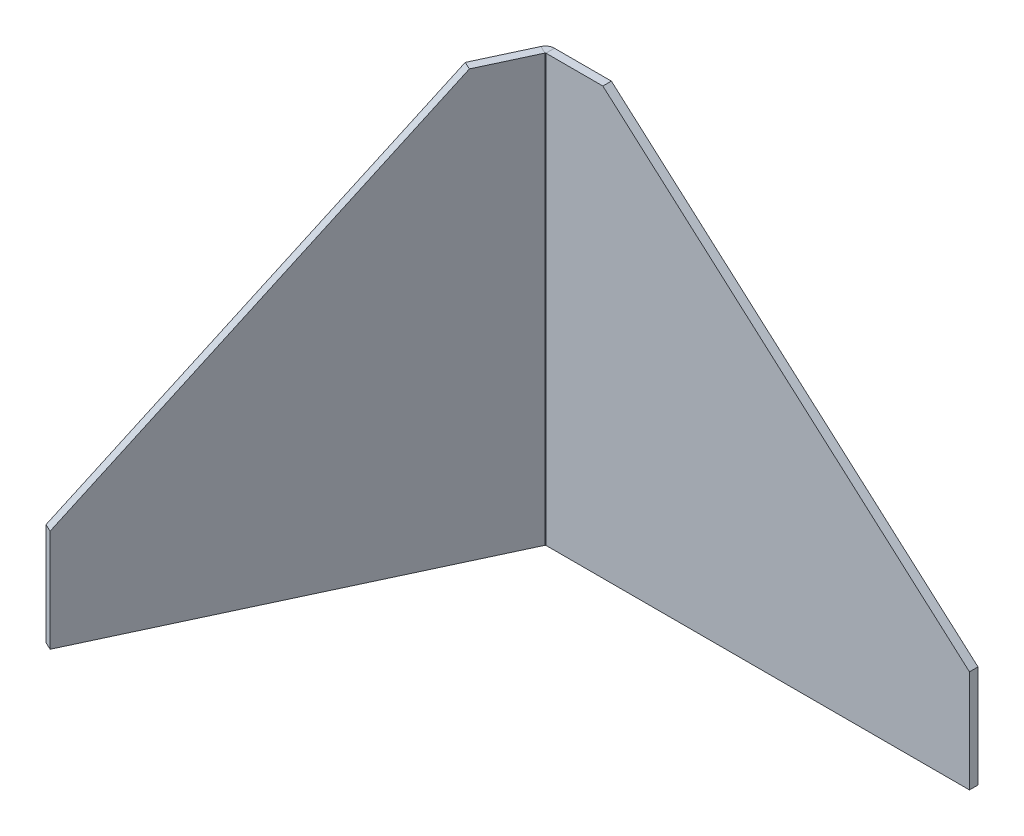
ISO-10303-21;
HEADER;
FILE_DESCRIPTION(('STEP AP214'),'2;1');
FILE_NAME('part.step','',(''),(''),'','','');
FILE_SCHEMA(('AUTOMOTIVE_DESIGN { 1 0 10303 214 1 1 1 1 }'));
ENDSEC;
DATA;
#1=APPLICATION_CONTEXT('core data for automotive mechanical design processes');
#2=APPLICATION_PROTOCOL_DEFINITION('international standard','automotive_design',2000,#1);
#3=PRODUCT_CONTEXT('',#1,'mechanical');
#4=PRODUCT('Part','Part','',(#3));
#5=PRODUCT_RELATED_PRODUCT_CATEGORY('part','',(#4));
#6=PRODUCT_DEFINITION_FORMATION('','',#4);
#7=PRODUCT_DEFINITION_CONTEXT('part definition',#1,'design');
#8=PRODUCT_DEFINITION('design','',#6,#7);
#9=PRODUCT_DEFINITION_SHAPE('','',#8);
#10=(LENGTH_UNIT() NAMED_UNIT(*) SI_UNIT(.MILLI.,.METRE.));
#11=(NAMED_UNIT(*) PLANE_ANGLE_UNIT() SI_UNIT($,.RADIAN.));
#12=(NAMED_UNIT(*) SI_UNIT($,.STERADIAN.) SOLID_ANGLE_UNIT());
#13=UNCERTAINTY_MEASURE_WITH_UNIT(LENGTH_MEASURE(1.E-05),#10,'distance_accuracy_value','');
#14=(GEOMETRIC_REPRESENTATION_CONTEXT(3) GLOBAL_UNCERTAINTY_ASSIGNED_CONTEXT((#13)) GLOBAL_UNIT_ASSIGNED_CONTEXT((#10,
#11,#12)) REPRESENTATION_CONTEXT('',''));
#15=CARTESIAN_POINT('',(0.,0.,0.));
#16=DIRECTION('',(0.,0.,1.));
#17=DIRECTION('',(1.,0.,0.));
#18=AXIS2_PLACEMENT_3D('',#15,#16,#17);
#19=CARTESIAN_POINT('',(-143490.189595738,128567.414220515,-6.74999347933181));
#20=DIRECTION('',(0.,1.,0.));
#21=DIRECTION('',(0.906307787036651,0.,0.422618261740697));
#22=AXIS2_PLACEMENT_3D('',#19,#20,#21);
#23=PLANE('',#22);
#24=DIRECTION('',(-0.422618261740697,0.,0.906307787036651));
#25=VECTOR('',#24,1.);
#26=CARTESIAN_POINT('',(-143481.126517868,128567.414220515,-2.52381086192988));
#27=LINE('',#26,#25);
#28=CARTESIAN_POINT('',(-143482.501710563,128567.414220515,0.425299388402189));
#29=VERTEX_POINT('',#28);
#30=CARTESIAN_POINT('',(-143510.70979619,128567.414220515,60.9177342306285));
#31=VERTEX_POINT('',#30);
#32=EDGE_CURVE('E149',#29,#31,#27,.T.);
#33=ORIENTED_EDGE('',*,*,#32,.F.);
#34=DIRECTION('',(-0.906307787036651,0.,-0.422618261740697));
#35=VECTOR('',#34,1.);
#36=CARTESIAN_POINT('',(-143491.564788433,128567.414220515,-3.80088322901884));
#37=LINE('',#36,#35);
#38=CARTESIAN_POINT('',(-143491.564788433,128567.414220515,-3.80088322899619));
#39=VERTEX_POINT('',#38);
#40=EDGE_CURVE('E133',#29,#39,#37,.T.);
#41=ORIENTED_EDGE('',*,*,#40,.T.);
#42=DIRECTION('',(-0.422618261740697,0.,0.906307787036651));
#43=VECTOR('',#42,1.);
#44=CARTESIAN_POINT('',(-143490.189595738,128567.414220515,-6.74999347933181));
#45=LINE('',#44,#43);
#46=CARTESIAN_POINT('',(-143519.77287406,128567.414220515,56.6915516132269));
#47=VERTEX_POINT('',#46);
#48=EDGE_CURVE('E44',#39,#47,#45,.T.);
#49=ORIENTED_EDGE('',*,*,#48,.T.);
#50=DIRECTION('',(0.906307787036651,0.,0.422618261740697));
#51=VECTOR('',#50,1.);
#52=CARTESIAN_POINT('',(-143519.77287406,128567.414220515,56.6915516132269));
#53=LINE('',#52,#51);
#54=EDGE_CURVE('E158',#47,#31,#53,.T.);
#55=ORIENTED_EDGE('',*,*,#54,.T.);
#56=EDGE_LOOP('',(#33,#41,#49,#55));
#57=FACE_BOUND('',#56,.T.);
#58=ADVANCED_FACE('F40',(#57),#23,.T.);
#59=CARTESIAN_POINT('',(-143676.141630904,128067.414220515,392.02543281678));
#60=DIRECTION('',(0.,-1.,0.));
#61=DIRECTION('',(-0.906307787036651,0.,-0.422618261740697));
#62=AXIS2_PLACEMENT_3D('',#59,#60,#61);
#63=PLANE('',#62);
#64=DIRECTION('',(0.422618261740697,0.,-0.906307787036651));
#65=VECTOR('',#64,1.);
#66=CARTESIAN_POINT('',(-143676.141630904,128067.414220515,392.02543281678));
#67=LINE('',#66,#65);
#68=CARTESIAN_POINT('',(-143676.141630904,128067.414220515,392.02543281678));
#69=VERTEX_POINT('',#68);
#70=CARTESIAN_POINT('',(-143491.564788433,128067.414220515,-3.80088322901884));
#71=VERTEX_POINT('',#70);
#72=EDGE_CURVE('E156',#69,#71,#67,.T.);
#73=ORIENTED_EDGE('',*,*,#72,.T.);
#74=DIRECTION('',(0.906307787036651,0.,0.422618261740697));
#75=VECTOR('',#74,1.);
#76=CARTESIAN_POINT('',(-143491.564788433,128067.414220515,-3.80088322901884));
#77=LINE('',#76,#75);
#78=CARTESIAN_POINT('',(-143482.501710563,128067.414220515,0.425299388402856));
#79=VERTEX_POINT('',#78);
#80=EDGE_CURVE('E12',#71,#79,#77,.T.);
#81=ORIENTED_EDGE('',*,*,#80,.T.);
#82=DIRECTION('',(0.422618261740697,0.,-0.906307787036651));
#83=VECTOR('',#82,1.);
#84=CARTESIAN_POINT('',(-143667.078553034,128067.414220515,396.251615434182));
#85=LINE('',#84,#83);
#86=CARTESIAN_POINT('',(-143667.078553034,128067.414220515,396.251615434182));
#87=VERTEX_POINT('',#86);
#88=EDGE_CURVE('E160',#87,#79,#85,.T.);
#89=ORIENTED_EDGE('',*,*,#88,.F.);
#90=DIRECTION('',(0.906307787036651,0.,0.422618261740697));
#91=VECTOR('',#90,1.);
#92=CARTESIAN_POINT('',(-143676.141630904,128067.414220515,392.02543281678));
#93=LINE('',#92,#91);
#94=EDGE_CURVE('E66',#69,#87,#93,.T.);
#95=ORIENTED_EDGE('',*,*,#94,.F.);
#96=EDGE_LOOP('',(#73,#81,#89,#95));
#97=FACE_BOUND('',#96,.T.);
#98=ADVANCED_FACE('F42',(#97),#63,.T.);
#99=CARTESIAN_POINT('',(-82850.7710740879,8.5265128291212E-11,-130048.402668836));
#100=DIRECTION('',(-0.906307787036651,0.,-0.422618261740697));
#101=DIRECTION('',(-0.422618261740697,0.,0.906307787036651));
#102=AXIS2_PLACEMENT_3D('',#99,#100,#101);
#103=PLANE('',#102);
#104=ORIENTED_EDGE('',*,*,#48,.F.);
#105=DIRECTION('',(0.,-1.,0.));
#106=VECTOR('',#105,1.);
#107=CARTESIAN_POINT('',(-143491.564788433,0.,-3.80088322901884));
#108=LINE('',#107,#106);
#109=EDGE_CURVE('E128',#39,#71,#108,.T.);
#110=ORIENTED_EDGE('',*,*,#109,.T.);
#111=ORIENTED_EDGE('',*,*,#72,.F.);
#112=DIRECTION('',(0.,-1.,0.));
#113=VECTOR('',#112,1.);
#114=CARTESIAN_POINT('',(-143676.141630904,128067.414220515,392.02543281678));
#115=LINE('',#114,#113);
#116=CARTESIAN_POINT('',(-143676.141630904,128187.414220515,392.02543281678));
#117=VERTEX_POINT('',#116);
#118=EDGE_CURVE('E159',#117,#69,#115,.T.);
#119=ORIENTED_EDGE('',*,*,#118,.F.);
#120=DIRECTION('',(-0.294825549996127,-0.716471188104806,0.632255432309734));
#121=VECTOR('',#120,1.);
#122=CARTESIAN_POINT('',(-143676.141630904,128187.414220515,392.02543281678));
#123=LINE('',#122,#121);
#124=EDGE_CURVE('E148',#47,#117,#123,.T.);
#125=ORIENTED_EDGE('',*,*,#124,.F.);
#126=EDGE_LOOP('',(#104,#110,#111,#119,#125));
#127=FACE_BOUND('',#126,.T.);
#128=ADVANCED_FACE('F145',(#127),#103,.T.);
#129=CARTESIAN_POINT('',(-143676.141630904,128067.414220515,392.02543281678));
#130=DIRECTION('',(-0.422618261740697,0.,0.906307787036651));
#131=DIRECTION('',(0.906307787036651,0.,0.422618261740697));
#132=AXIS2_PLACEMENT_3D('',#129,#130,#131);
#133=PLANE('',#132);
#134=DIRECTION('',(0.,-1.,0.));
#135=VECTOR('',#134,1.);
#136=CARTESIAN_POINT('',(-143667.078553034,128067.414220515,396.251615434182));
#137=LINE('',#136,#135);
#138=CARTESIAN_POINT('',(-143667.078553034,128187.414220515,396.251615434181));
#139=VERTEX_POINT('',#138);
#140=EDGE_CURVE('E162',#139,#87,#137,.T.);
#141=ORIENTED_EDGE('',*,*,#140,.F.);
#142=DIRECTION('',(0.906307787036651,0.,0.422618261740697));
#143=VECTOR('',#142,1.);
#144=CARTESIAN_POINT('',(-143676.141630904,128187.414220515,392.02543281678));
#145=LINE('',#144,#143);
#146=EDGE_CURVE('E170',#117,#139,#145,.T.);
#147=ORIENTED_EDGE('',*,*,#146,.F.);
#148=ORIENTED_EDGE('',*,*,#118,.T.);
#149=ORIENTED_EDGE('',*,*,#94,.T.);
#150=EDGE_LOOP('',(#141,#147,#148,#149));
#151=FACE_BOUND('',#150,.T.);
#152=ADVANCED_FACE('F265',(#151),#133,.T.);
#153=CARTESIAN_POINT('',(-143676.141630904,128187.414220515,392.02543281678));
#154=DIRECTION('',(-0.302793808104145,0.697616683154644,0.649343416966787));
#155=DIRECTION('',(-0.294825549996127,-0.716471188104806,0.632255432309734));
#156=AXIS2_PLACEMENT_3D('',#153,#154,#155);
#157=PLANE('',#156);
#158=DIRECTION('',(-0.294825549996127,-0.716471188104806,0.632255432309734));
#159=VECTOR('',#158,1.);
#160=CARTESIAN_POINT('',(-143667.078553034,128187.414220515,396.251615434181));
#161=LINE('',#160,#159);
#162=EDGE_CURVE('E168',#31,#139,#161,.T.);
#163=ORIENTED_EDGE('',*,*,#162,.F.);
#164=ORIENTED_EDGE('',*,*,#54,.F.);
#165=ORIENTED_EDGE('',*,*,#124,.T.);
#166=ORIENTED_EDGE('',*,*,#146,.T.);
#167=EDGE_LOOP('',(#163,#164,#165,#166));
#168=FACE_BOUND('',#167,.T.);
#169=ADVANCED_FACE('F171',(#168),#157,.T.);
#170=CARTESIAN_POINT('',(-82841.7079962176,8.5265128291212E-11,-130044.176486218));
#171=DIRECTION('',(-0.906307787036651,0.,-0.422618261740697));
#172=DIRECTION('',(-0.422618261740697,0.,0.906307787036651));
#173=AXIS2_PLACEMENT_3D('',#170,#171,#172);
#174=PLANE('',#173);
#175=DIRECTION('',(0.,-1.,0.));
#176=VECTOR('',#175,1.);
#177=CARTESIAN_POINT('',(-143482.501710563,0.,0.425299388382427));
#178=LINE('',#177,#176);
#179=EDGE_CURVE('E49',#29,#79,#178,.T.);
#180=ORIENTED_EDGE('',*,*,#179,.F.);
#181=ORIENTED_EDGE('',*,*,#32,.T.);
#182=ORIENTED_EDGE('',*,*,#162,.T.);
#183=ORIENTED_EDGE('',*,*,#140,.T.);
#184=ORIENTED_EDGE('',*,*,#88,.T.);
#185=EDGE_LOOP('',(#180,#181,#182,#183,#184));
#186=FACE_BOUND('',#185,.T.);
#187=ADVANCED_FACE('F165',(#186),#174,.F.);
#188=CARTESIAN_POINT('',(-142985.088107377,128067.414220515,-10.));
#189=DIRECTION('',(1.,0.,0.));
#190=DIRECTION('',(0.,0.,-1.));
#191=AXIS2_PLACEMENT_3D('',#188,#189,#190);
#192=PLANE('',#191);
#193=DIRECTION('',(0.,1.,0.));
#194=VECTOR('',#193,1.);
#195=CARTESIAN_POINT('',(-142985.088107377,128067.414220515,0.));
#196=LINE('',#195,#194);
#197=CARTESIAN_POINT('',(-142985.088107377,128067.414220515,0.));
#198=VERTEX_POINT('',#197);
#199=CARTESIAN_POINT('',(-142985.088107377,128187.414220515,0.));
#200=VERTEX_POINT('',#199);
#201=EDGE_CURVE('E208',#198,#200,#196,.T.);
#202=ORIENTED_EDGE('',*,*,#201,.F.);
#203=DIRECTION('',(0.,0.,1.));
#204=VECTOR('',#203,1.);
#205=CARTESIAN_POINT('',(-142985.088107377,128067.414220515,-10.));
#206=LINE('',#205,#204);
#207=CARTESIAN_POINT('',(-142985.088107377,128067.414220515,-10.));
#208=VERTEX_POINT('',#207);
#209=EDGE_CURVE('E172',#208,#198,#206,.T.);
#210=ORIENTED_EDGE('',*,*,#209,.F.);
#211=DIRECTION('',(0.,1.,0.));
#212=VECTOR('',#211,1.);
#213=CARTESIAN_POINT('',(-142985.088107377,128067.414220515,-10.));
#214=LINE('',#213,#212);
#215=CARTESIAN_POINT('',(-142985.088107377,128187.414220515,-10.));
#216=VERTEX_POINT('',#215);
#217=EDGE_CURVE('E189',#208,#216,#214,.T.);
#218=ORIENTED_EDGE('',*,*,#217,.T.);
#219=DIRECTION('',(0.,0.,1.));
#220=VECTOR('',#219,1.);
#221=CARTESIAN_POINT('',(-142985.088107377,128187.414220515,-10.));
#222=LINE('',#221,#220);
#223=EDGE_CURVE('E192',#216,#200,#222,.T.);
#224=ORIENTED_EDGE('',*,*,#223,.T.);
#225=EDGE_LOOP('',(#202,#210,#218,#224));
#226=FACE_BOUND('',#225,.T.);
#227=ADVANCED_FACE('F240',(#226),#192,.T.);
#228=CARTESIAN_POINT('',(-142985.088107377,128187.414220515,-10.));
#229=DIRECTION('',(0.662197796471728,0.749329085481131,0.));
#230=DIRECTION('',(-0.749329085481131,0.662197796471728,0.));
#231=AXIS2_PLACEMENT_3D('',#228,#229,#230);
#232=PLANE('',#231);
#233=DIRECTION('',(-0.749329085481131,0.662197796471728,0.));
#234=VECTOR('',#233,1.);
#235=CARTESIAN_POINT('',(-142985.088107377,128187.414220515,0.));
#236=LINE('',#235,#234);
#237=CARTESIAN_POINT('',(-143415.088107377,128567.414220515,0.));
#238=VERTEX_POINT('',#237);
#239=EDGE_CURVE('E211',#200,#238,#236,.T.);
#240=ORIENTED_EDGE('',*,*,#239,.F.);
#241=ORIENTED_EDGE('',*,*,#223,.F.);
#242=DIRECTION('',(-0.749329085481131,0.662197796471728,0.));
#243=VECTOR('',#242,1.);
#244=CARTESIAN_POINT('',(-142985.088107377,128187.414220515,-10.));
#245=LINE('',#244,#243);
#246=CARTESIAN_POINT('',(-143415.088107377,128567.414220515,-9.99999999999979));
#247=VERTEX_POINT('',#246);
#248=EDGE_CURVE('E194',#216,#247,#245,.T.);
#249=ORIENTED_EDGE('',*,*,#248,.T.);
#250=DIRECTION('',(0.,0.,1.));
#251=VECTOR('',#250,1.);
#252=CARTESIAN_POINT('',(-143415.088107377,128567.414220515,-9.99999999999979));
#253=LINE('',#252,#251);
#254=EDGE_CURVE('E197',#247,#238,#253,.T.);
#255=ORIENTED_EDGE('',*,*,#254,.T.);
#256=EDGE_LOOP('',(#240,#241,#249,#255));
#257=FACE_BOUND('',#256,.T.);
#258=ADVANCED_FACE('F245',(#257),#232,.T.);
#259=CARTESIAN_POINT('',(0.,0.,-10.));
#260=DIRECTION('',(0.,0.,-1.));
#261=DIRECTION('',(-1.,0.,0.));
#262=AXIS2_PLACEMENT_3D('',#259,#260,#261);
#263=PLANE('',#262);
#264=DIRECTION('',(0.,-1.,0.));
#265=VECTOR('',#264,1.);
#266=CARTESIAN_POINT('',(-143481.834124247,0.,-10.));
#267=LINE('',#266,#265);
#268=CARTESIAN_POINT('',(-143481.834124247,128567.414220515,-9.99999999999601));
#269=VERTEX_POINT('',#268);
#270=CARTESIAN_POINT('',(-143481.834124247,128067.414220515,-9.99999999999934));
#271=VERTEX_POINT('',#270);
#272=EDGE_CURVE('E183',#269,#271,#267,.T.);
#273=ORIENTED_EDGE('',*,*,#272,.F.);
#274=DIRECTION('',(-1.,0.,0.));
#275=VECTOR('',#274,1.);
#276=CARTESIAN_POINT('',(-143485.088107377,128567.414220515,-10.));
#277=LINE('',#276,#275);
#278=EDGE_CURVE('E199',#247,#269,#277,.T.);
#279=ORIENTED_EDGE('',*,*,#278,.F.);
#280=ORIENTED_EDGE('',*,*,#248,.F.);
#281=ORIENTED_EDGE('',*,*,#217,.F.);
#282=DIRECTION('',(1.,0.,0.));
#283=VECTOR('',#282,1.);
#284=CARTESIAN_POINT('',(-143925.088107377,128067.414220515,-10.));
#285=LINE('',#284,#283);
#286=EDGE_CURVE('E176',#271,#208,#285,.T.);
#287=ORIENTED_EDGE('',*,*,#286,.F.);
#288=EDGE_LOOP('',(#273,#279,#280,#281,#287));
#289=FACE_BOUND('',#288,.T.);
#290=ADVANCED_FACE('F234',(#289),#263,.T.);
#291=CARTESIAN_POINT('',(-143485.088107377,128567.414220515,-10.));
#292=DIRECTION('',(0.,1.,0.));
#293=DIRECTION('',(0.,0.,1.));
#294=AXIS2_PLACEMENT_3D('',#291,#292,#293);
#295=PLANE('',#294);
#296=DIRECTION('',(0.,0.,-1.));
#297=VECTOR('',#296,1.);
#298=CARTESIAN_POINT('',(-143481.834124247,128567.414220515,-10.));
#299=LINE('',#298,#297);
#300=CARTESIAN_POINT('',(-143481.834124247,128567.414220515,0.));
#301=VERTEX_POINT('',#300);
#302=EDGE_CURVE('E141',#301,#269,#299,.T.);
#303=ORIENTED_EDGE('',*,*,#302,.F.);
#304=DIRECTION('',(-1.,0.,0.));
#305=VECTOR('',#304,1.);
#306=CARTESIAN_POINT('',(-143485.088107377,128567.414220515,0.));
#307=LINE('',#306,#305);
#308=EDGE_CURVE('E201',#238,#301,#307,.T.);
#309=ORIENTED_EDGE('',*,*,#308,.F.);
#310=ORIENTED_EDGE('',*,*,#254,.F.);
#311=ORIENTED_EDGE('',*,*,#278,.T.);
#312=EDGE_LOOP('',(#303,#309,#310,#311));
#313=FACE_BOUND('',#312,.T.);
#314=ADVANCED_FACE('F244',(#313),#295,.T.);
#315=CARTESIAN_POINT('',(0.,0.,0.));
#316=DIRECTION('',(0.,0.,-1.));
#317=DIRECTION('',(-1.,0.,0.));
#318=AXIS2_PLACEMENT_3D('',#315,#316,#317);
#319=PLANE('',#318);
#320=ORIENTED_EDGE('',*,*,#308,.T.);
#321=DIRECTION('',(0.,-1.,0.));
#322=VECTOR('',#321,1.);
#323=CARTESIAN_POINT('',(-143481.834124247,0.,0.));
#324=LINE('',#323,#322);
#325=CARTESIAN_POINT('',(-143481.834124247,128067.414220515,6.66133814775094E-13));
#326=VERTEX_POINT('',#325);
#327=EDGE_CURVE('E203',#301,#326,#324,.T.);
#328=ORIENTED_EDGE('',*,*,#327,.T.);
#329=DIRECTION('',(1.,0.,0.));
#330=VECTOR('',#329,1.);
#331=CARTESIAN_POINT('',(-143925.088107377,128067.414220515,0.));
#332=LINE('',#331,#330);
#333=EDGE_CURVE('E206',#326,#198,#332,.T.);
#334=ORIENTED_EDGE('',*,*,#333,.T.);
#335=ORIENTED_EDGE('',*,*,#201,.T.);
#336=ORIENTED_EDGE('',*,*,#239,.T.);
#337=EDGE_LOOP('',(#320,#328,#334,#335,#336));
#338=FACE_BOUND('',#337,.T.);
#339=ADVANCED_FACE('F224',(#338),#319,.F.);
#340=CARTESIAN_POINT('',(-143925.088107377,128067.414220515,-10.));
#341=DIRECTION('',(0.,-1.,0.));
#342=DIRECTION('',(0.,0.,-1.));
#343=AXIS2_PLACEMENT_3D('',#340,#341,#342);
#344=PLANE('',#343);
#345=DIRECTION('',(0.,0.,1.));
#346=VECTOR('',#345,1.);
#347=CARTESIAN_POINT('',(-143481.834124247,128067.414220515,-9.99999999999934));
#348=LINE('',#347,#346);
#349=EDGE_CURVE('E185',#271,#326,#348,.T.);
#350=ORIENTED_EDGE('',*,*,#349,.F.);
#351=ORIENTED_EDGE('',*,*,#286,.T.);
#352=ORIENTED_EDGE('',*,*,#209,.T.);
#353=ORIENTED_EDGE('',*,*,#333,.F.);
#354=EDGE_LOOP('',(#350,#351,#352,#353));
#355=FACE_BOUND('',#354,.T.);
#356=ADVANCED_FACE('F230',(#355),#344,.T.);
#357=CARTESIAN_POINT('',(-143481.834124247,128567.414220515,0.736600000000309));
#358=DIRECTION('',(0.,1.,0.));
#359=DIRECTION('',(0.,0.,1.));
#360=AXIS2_PLACEMENT_3D('',#357,#358,#359);
#361=PLANE('',#360);
#362=ORIENTED_EDGE('',*,*,#40,.F.);
#363=CARTESIAN_POINT('',(-143481.834124247,128567.414220515,0.736600000000309));
#364=DIRECTION('',(0.,1.,0.));
#365=DIRECTION('',(0.,0.,1.));
#366=AXIS2_PLACEMENT_3D('',#363,#364,#365);
#367=CIRCLE('',#366,0.7366);
#368=EDGE_CURVE('E217',#29,#301,#367,.F.);
#369=ORIENTED_EDGE('',*,*,#368,.T.);
#370=ORIENTED_EDGE('',*,*,#302,.T.);
#371=CARTESIAN_POINT('',(-143481.834124247,128567.414220515,0.736600000000309));
#372=DIRECTION('',(0.,-1.,0.));
#373=DIRECTION('',(0.,0.,1.));
#374=AXIS2_PLACEMENT_3D('',#371,#372,#373);
#375=CIRCLE('',#374,10.7365999999959);
#376=EDGE_CURVE('E131',#39,#269,#375,.T.);
#377=ORIENTED_EDGE('',*,*,#376,.F.);
#378=EDGE_LOOP('',(#362,#369,#370,#377));
#379=FACE_BOUND('',#378,.T.);
#380=ADVANCED_FACE('F137',(#379),#361,.T.);
#381=CARTESIAN_POINT('',(-143481.834124247,128067.414220515,0.736599999999976));
#382=DIRECTION('',(0.,-1.,0.));
#383=DIRECTION('',(0.,0.,-1.));
#384=AXIS2_PLACEMENT_3D('',#381,#382,#383);
#385=PLANE('',#384);
#386=CARTESIAN_POINT('',(-143481.834124247,128067.414220515,0.736599999999976));
#387=DIRECTION('',(0.,1.,0.));
#388=DIRECTION('',(0.,0.,1.));
#389=AXIS2_PLACEMENT_3D('',#386,#387,#388);
#390=CIRCLE('',#389,0.7366);
#391=EDGE_CURVE('E142',#326,#79,#390,.T.);
#392=ORIENTED_EDGE('',*,*,#391,.T.);
#393=ORIENTED_EDGE('',*,*,#80,.F.);
#394=CARTESIAN_POINT('',(-143481.834124247,128067.414220515,0.736599999999976));
#395=DIRECTION('',(0.,1.,0.));
#396=DIRECTION('',(0.,0.,-1.));
#397=AXIS2_PLACEMENT_3D('',#394,#395,#396);
#398=CIRCLE('',#397,10.7365999999959);
#399=EDGE_CURVE('E57',#271,#71,#398,.T.);
#400=ORIENTED_EDGE('',*,*,#399,.F.);
#401=ORIENTED_EDGE('',*,*,#349,.T.);
#402=EDGE_LOOP('',(#392,#393,#400,#401));
#403=FACE_BOUND('',#402,.T.);
#404=ADVANCED_FACE('F228',(#403),#385,.T.);
#405=CARTESIAN_POINT('',(-143481.834124247,127817.271887149,0.736600000000309));
#406=DIRECTION('',(0.,1.,0.));
#407=DIRECTION('',(0.,0.,1.));
#408=AXIS2_PLACEMENT_3D('',#405,#406,#407);
#409=CYLINDRICAL_SURFACE('',#408,10.7366);
#410=ORIENTED_EDGE('',*,*,#272,.T.);
#411=ORIENTED_EDGE('',*,*,#399,.T.);
#412=ORIENTED_EDGE('',*,*,#109,.F.);
#413=ORIENTED_EDGE('',*,*,#376,.T.);
#414=EDGE_LOOP('',(#410,#411,#412,#413));
#415=FACE_BOUND('',#414,.T.);
#416=ADVANCED_FACE('F130',(#415),#409,.T.);
#417=CARTESIAN_POINT('',(-143481.834124247,127817.271887149,0.736600000000309));
#418=DIRECTION('',(0.,1.,0.));
#419=DIRECTION('',(0.,0.,1.));
#420=AXIS2_PLACEMENT_3D('',#417,#418,#419);
#421=CYLINDRICAL_SURFACE('',#420,0.7366);
#422=ORIENTED_EDGE('',*,*,#327,.F.);
#423=ORIENTED_EDGE('',*,*,#368,.F.);
#424=ORIENTED_EDGE('',*,*,#179,.T.);
#425=ORIENTED_EDGE('',*,*,#391,.F.);
#426=EDGE_LOOP('',(#422,#423,#424,#425));
#427=FACE_BOUND('',#426,.T.);
#428=ADVANCED_FACE('F221',(#427),#421,.F.);
#429=CLOSED_SHELL('',(#58,#98,#128,#152,#169,#187,#227,#258,#290,#314,#339,#356,#380,#404,#416,#428));
#430=MANIFOLD_SOLID_BREP('B2',#429);
#431=ADVANCED_BREP_SHAPE_REPRESENTATION('',(#18,#430),#14);
#432=SHAPE_DEFINITION_REPRESENTATION(#9,#431);
ENDSEC;
END-ISO-10303-21;
